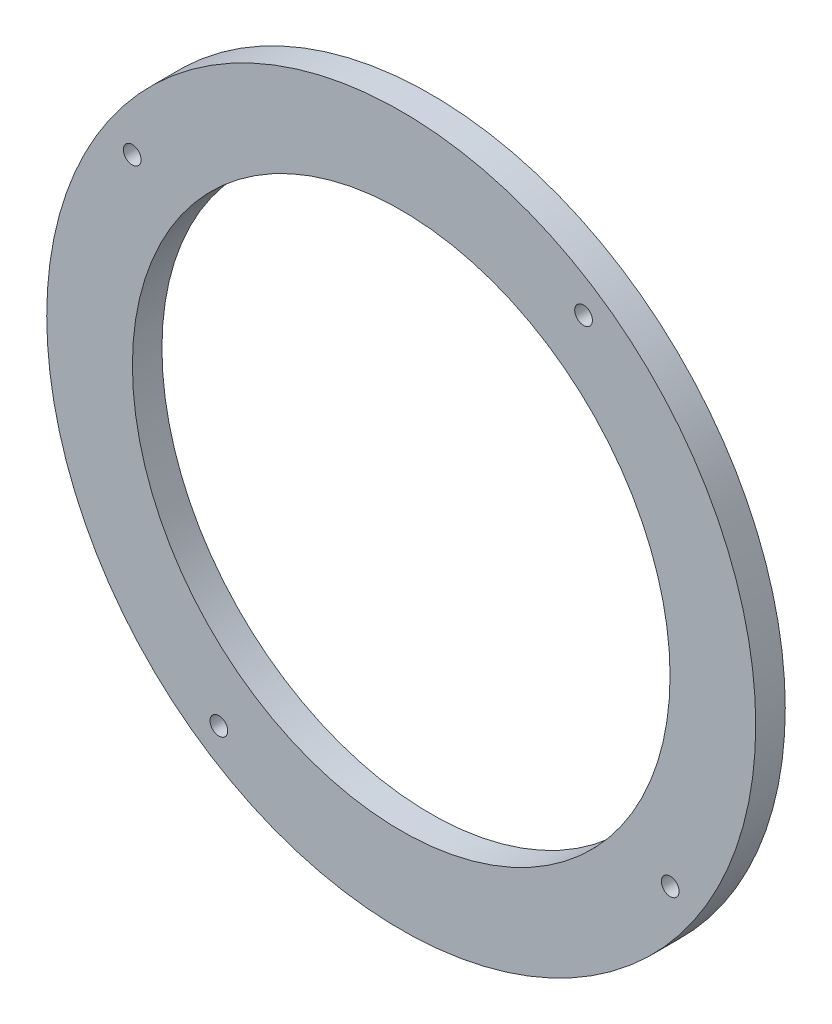
ISO-10303-21;
HEADER;
FILE_DESCRIPTION(('STEP AP214'),'2;1');
FILE_NAME('part.step','',(''),(''),'','','');
FILE_SCHEMA(('AUTOMOTIVE_DESIGN { 1 0 10303 214 1 1 1 1 }'));
ENDSEC;
DATA;
#1=APPLICATION_CONTEXT('core data for automotive mechanical design processes');
#2=APPLICATION_PROTOCOL_DEFINITION('international standard','automotive_design',2000,#1);
#3=PRODUCT_CONTEXT('',#1,'mechanical');
#4=PRODUCT('Part','Part','',(#3));
#5=PRODUCT_RELATED_PRODUCT_CATEGORY('part','',(#4));
#6=PRODUCT_DEFINITION_FORMATION('','',#4);
#7=PRODUCT_DEFINITION_CONTEXT('part definition',#1,'design');
#8=PRODUCT_DEFINITION('design','',#6,#7);
#9=PRODUCT_DEFINITION_SHAPE('','',#8);
#10=(LENGTH_UNIT() NAMED_UNIT(*) SI_UNIT(.MILLI.,.METRE.));
#11=(NAMED_UNIT(*) PLANE_ANGLE_UNIT() SI_UNIT($,.RADIAN.));
#12=(NAMED_UNIT(*) SI_UNIT($,.STERADIAN.) SOLID_ANGLE_UNIT());
#13=UNCERTAINTY_MEASURE_WITH_UNIT(LENGTH_MEASURE(1.E-05),#10,'distance_accuracy_value','');
#14=(GEOMETRIC_REPRESENTATION_CONTEXT(3) GLOBAL_UNCERTAINTY_ASSIGNED_CONTEXT((#13)) GLOBAL_UNIT_ASSIGNED_CONTEXT((#10,
#11,#12)) REPRESENTATION_CONTEXT('',''));
#15=CARTESIAN_POINT('',(0.,0.,0.));
#16=DIRECTION('',(0.,0.,1.));
#17=DIRECTION('',(1.,0.,0.));
#18=AXIS2_PLACEMENT_3D('',#15,#16,#17);
#19=CARTESIAN_POINT('',(0.,0.,5.));
#20=DIRECTION('',(0.,0.,1.));
#21=DIRECTION('',(1.,0.,0.));
#22=AXIS2_PLACEMENT_3D('',#19,#20,#21);
#23=PLANE('',#22);
#24=CARTESIAN_POINT('',(-30.8599079291922,-45.5265426163878,5.));
#25=DIRECTION('',(0.,0.,1.));
#26=DIRECTION('',(1.,0.,0.));
#27=AXIS2_PLACEMENT_3D('',#24,#25,#26);
#28=CIRCLE('',#27,1.5);
#29=CARTESIAN_POINT('',(-29.3599079291922,-45.5265426163878,5.));
#30=VERTEX_POINT('',#29);
#31=EDGE_CURVE('E68',#30,#30,#28,.T.);
#32=ORIENTED_EDGE('',*,*,#31,.F.);
#33=EDGE_LOOP('',(#32));
#34=FACE_BOUND('',#33,.T.);
#35=CARTESIAN_POINT('',(-45.5265426163877,30.8599079291924,5.));
#36=DIRECTION('',(0.,0.,1.));
#37=DIRECTION('',(1.,0.,0.));
#38=AXIS2_PLACEMENT_3D('',#35,#36,#37);
#39=CIRCLE('',#38,1.5);
#40=CARTESIAN_POINT('',(-44.0265426163877,30.8599079291924,5.));
#41=VERTEX_POINT('',#40);
#42=EDGE_CURVE('E62',#41,#41,#39,.T.);
#43=ORIENTED_EDGE('',*,*,#42,.F.);
#44=EDGE_LOOP('',(#43));
#45=FACE_BOUND('',#44,.T.);
#46=CARTESIAN_POINT('',(30.8599079291926,45.5265426163876,5.));
#47=DIRECTION('',(0.,0.,1.));
#48=DIRECTION('',(1.,0.,0.));
#49=AXIS2_PLACEMENT_3D('',#46,#47,#48);
#50=CIRCLE('',#49,1.5);
#51=CARTESIAN_POINT('',(32.3599079291926,45.5265426163876,5.));
#52=VERTEX_POINT('',#51);
#53=EDGE_CURVE('E56',#52,#52,#50,.T.);
#54=ORIENTED_EDGE('',*,*,#53,.F.);
#55=EDGE_LOOP('',(#54));
#56=FACE_BOUND('',#55,.T.);
#57=CARTESIAN_POINT('',(45.5265426163875,-30.8599079291927,5.));
#58=DIRECTION('',(0.,0.,1.));
#59=DIRECTION('',(1.,0.,0.));
#60=AXIS2_PLACEMENT_3D('',#57,#58,#59);
#61=CIRCLE('',#60,1.5);
#62=CARTESIAN_POINT('',(47.0265426163875,-30.8599079291927,5.));
#63=VERTEX_POINT('',#62);
#64=EDGE_CURVE('E50',#63,#63,#61,.T.);
#65=ORIENTED_EDGE('',*,*,#64,.F.);
#66=EDGE_LOOP('',(#65));
#67=FACE_BOUND('',#66,.T.);
#68=CARTESIAN_POINT('',(0.,0.,5.));
#69=DIRECTION('',(0.,0.,1.));
#70=DIRECTION('',(1.,0.,0.));
#71=AXIS2_PLACEMENT_3D('',#68,#69,#70);
#72=CIRCLE('',#71,60.);
#73=CARTESIAN_POINT('',(60.,0.,5.));
#74=VERTEX_POINT('',#73);
#75=EDGE_CURVE('E10',#74,#74,#72,.T.);
#76=ORIENTED_EDGE('',*,*,#75,.T.);
#77=EDGE_LOOP('',(#76));
#78=FACE_BOUND('',#77,.T.);
#79=CARTESIAN_POINT('',(0.,0.,5.));
#80=DIRECTION('',(0.,0.,1.));
#81=DIRECTION('',(1.,0.,0.));
#82=AXIS2_PLACEMENT_3D('',#79,#80,#81);
#83=CIRCLE('',#82,45.5);
#84=CARTESIAN_POINT('',(45.5,0.,5.));
#85=VERTEX_POINT('',#84);
#86=EDGE_CURVE('E42',#85,#85,#83,.T.);
#87=ORIENTED_EDGE('',*,*,#86,.F.);
#88=EDGE_LOOP('',(#87));
#89=FACE_BOUND('',#88,.T.);
#90=ADVANCED_FACE('F31',(#34,#45,#56,#67,#78,#89),#23,.T.);
#91=CARTESIAN_POINT('',(0.,0.,0.));
#92=DIRECTION('',(0.,0.,1.));
#93=DIRECTION('',(1.,0.,0.));
#94=AXIS2_PLACEMENT_3D('',#91,#92,#93);
#95=PLANE('',#94);
#96=CARTESIAN_POINT('',(-30.8599079291922,-45.5265426163878,0.));
#97=DIRECTION('',(0.,0.,1.));
#98=DIRECTION('',(1.,0.,0.));
#99=AXIS2_PLACEMENT_3D('',#96,#97,#98);
#100=CIRCLE('',#99,1.5);
#101=CARTESIAN_POINT('',(-29.3599079291922,-45.5265426163878,0.));
#102=VERTEX_POINT('',#101);
#103=EDGE_CURVE('E47',#102,#102,#100,.T.);
#104=ORIENTED_EDGE('',*,*,#103,.T.);
#105=EDGE_LOOP('',(#104));
#106=FACE_BOUND('',#105,.T.);
#107=CARTESIAN_POINT('',(-45.5265426163877,30.8599079291924,0.));
#108=DIRECTION('',(0.,0.,1.));
#109=DIRECTION('',(1.,0.,0.));
#110=AXIS2_PLACEMENT_3D('',#107,#108,#109);
#111=CIRCLE('',#110,1.5);
#112=CARTESIAN_POINT('',(-44.0265426163877,30.8599079291924,0.));
#113=VERTEX_POINT('',#112);
#114=EDGE_CURVE('E65',#113,#113,#111,.T.);
#115=ORIENTED_EDGE('',*,*,#114,.T.);
#116=EDGE_LOOP('',(#115));
#117=FACE_BOUND('',#116,.T.);
#118=CARTESIAN_POINT('',(30.8599079291926,45.5265426163876,0.));
#119=DIRECTION('',(0.,0.,1.));
#120=DIRECTION('',(1.,0.,0.));
#121=AXIS2_PLACEMENT_3D('',#118,#119,#120);
#122=CIRCLE('',#121,1.5);
#123=CARTESIAN_POINT('',(32.3599079291926,45.5265426163876,0.));
#124=VERTEX_POINT('',#123);
#125=EDGE_CURVE('E59',#124,#124,#122,.T.);
#126=ORIENTED_EDGE('',*,*,#125,.T.);
#127=EDGE_LOOP('',(#126));
#128=FACE_BOUND('',#127,.T.);
#129=CARTESIAN_POINT('',(45.5265426163875,-30.8599079291927,0.));
#130=DIRECTION('',(0.,0.,1.));
#131=DIRECTION('',(1.,0.,0.));
#132=AXIS2_PLACEMENT_3D('',#129,#130,#131);
#133=CIRCLE('',#132,1.5);
#134=CARTESIAN_POINT('',(47.0265426163875,-30.8599079291927,0.));
#135=VERTEX_POINT('',#134);
#136=EDGE_CURVE('E53',#135,#135,#133,.T.);
#137=ORIENTED_EDGE('',*,*,#136,.T.);
#138=EDGE_LOOP('',(#137));
#139=FACE_BOUND('',#138,.T.);
#140=CARTESIAN_POINT('',(0.,0.,0.));
#141=DIRECTION('',(0.,0.,1.));
#142=DIRECTION('',(1.,0.,0.));
#143=AXIS2_PLACEMENT_3D('',#140,#141,#142);
#144=CIRCLE('',#143,60.);
#145=CARTESIAN_POINT('',(60.,0.,0.));
#146=VERTEX_POINT('',#145);
#147=EDGE_CURVE('E35',#146,#146,#144,.T.);
#148=ORIENTED_EDGE('',*,*,#147,.F.);
#149=EDGE_LOOP('',(#148));
#150=FACE_BOUND('',#149,.T.);
#151=CARTESIAN_POINT('',(0.,0.,0.));
#152=DIRECTION('',(0.,0.,1.));
#153=DIRECTION('',(1.,0.,0.));
#154=AXIS2_PLACEMENT_3D('',#151,#152,#153);
#155=CIRCLE('',#154,45.5);
#156=CARTESIAN_POINT('',(45.5,0.,0.));
#157=VERTEX_POINT('',#156);
#158=EDGE_CURVE('E44',#157,#157,#155,.T.);
#159=ORIENTED_EDGE('',*,*,#158,.T.);
#160=EDGE_LOOP('',(#159));
#161=FACE_BOUND('',#160,.T.);
#162=ADVANCED_FACE('F74',(#106,#117,#128,#139,#150,#161),#95,.F.);
#163=CARTESIAN_POINT('',(0.,0.,5.));
#164=DIRECTION('',(0.,0.,-1.));
#165=DIRECTION('',(-1.,0.,0.));
#166=AXIS2_PLACEMENT_3D('',#163,#164,#165);
#167=CYLINDRICAL_SURFACE('',#166,60.);
#168=ORIENTED_EDGE('',*,*,#75,.F.);
#169=EDGE_LOOP('',(#168));
#170=FACE_BOUND('',#169,.T.);
#171=ORIENTED_EDGE('',*,*,#147,.T.);
#172=EDGE_LOOP('',(#171));
#173=FACE_BOUND('',#172,.T.);
#174=ADVANCED_FACE('F33',(#170,#173),#167,.T.);
#175=CARTESIAN_POINT('',(0.,0.,5.));
#176=DIRECTION('',(0.,0.,-1.));
#177=DIRECTION('',(-1.,0.,0.));
#178=AXIS2_PLACEMENT_3D('',#175,#176,#177);
#179=CYLINDRICAL_SURFACE('',#178,45.5);
#180=ORIENTED_EDGE('',*,*,#86,.T.);
#181=EDGE_LOOP('',(#180));
#182=FACE_BOUND('',#181,.T.);
#183=ORIENTED_EDGE('',*,*,#158,.F.);
#184=EDGE_LOOP('',(#183));
#185=FACE_BOUND('',#184,.T.);
#186=ADVANCED_FACE('F95',(#182,#185),#179,.F.);
#187=CARTESIAN_POINT('',(45.5265426163875,-30.8599079291927,0.));
#188=DIRECTION('',(0.,0.,1.));
#189=DIRECTION('',(1.,0.,0.));
#190=AXIS2_PLACEMENT_3D('',#187,#188,#189);
#191=CYLINDRICAL_SURFACE('',#190,1.5);
#192=ORIENTED_EDGE('',*,*,#136,.F.);
#193=EDGE_LOOP('',(#192));
#194=FACE_BOUND('',#193,.T.);
#195=ORIENTED_EDGE('',*,*,#64,.T.);
#196=EDGE_LOOP('',(#195));
#197=FACE_BOUND('',#196,.T.);
#198=ADVANCED_FACE('F98',(#194,#197),#191,.F.);
#199=CARTESIAN_POINT('',(30.8599079291926,45.5265426163876,0.));
#200=DIRECTION('',(0.,0.,1.));
#201=DIRECTION('',(1.,0.,0.));
#202=AXIS2_PLACEMENT_3D('',#199,#200,#201);
#203=CYLINDRICAL_SURFACE('',#202,1.5);
#204=ORIENTED_EDGE('',*,*,#125,.F.);
#205=EDGE_LOOP('',(#204));
#206=FACE_BOUND('',#205,.T.);
#207=ORIENTED_EDGE('',*,*,#53,.T.);
#208=EDGE_LOOP('',(#207));
#209=FACE_BOUND('',#208,.T.);
#210=ADVANCED_FACE('F110',(#206,#209),#203,.F.);
#211=CARTESIAN_POINT('',(-45.5265426163877,30.8599079291924,0.));
#212=DIRECTION('',(0.,0.,1.));
#213=DIRECTION('',(1.,0.,0.));
#214=AXIS2_PLACEMENT_3D('',#211,#212,#213);
#215=CYLINDRICAL_SURFACE('',#214,1.5);
#216=ORIENTED_EDGE('',*,*,#114,.F.);
#217=EDGE_LOOP('',(#216));
#218=FACE_BOUND('',#217,.T.);
#219=ORIENTED_EDGE('',*,*,#42,.T.);
#220=EDGE_LOOP('',(#219));
#221=FACE_BOUND('',#220,.T.);
#222=ADVANCED_FACE('F80',(#218,#221),#215,.F.);
#223=CARTESIAN_POINT('',(-30.8599079291922,-45.5265426163878,0.));
#224=DIRECTION('',(0.,0.,1.));
#225=DIRECTION('',(1.,0.,0.));
#226=AXIS2_PLACEMENT_3D('',#223,#224,#225);
#227=CYLINDRICAL_SURFACE('',#226,1.5);
#228=ORIENTED_EDGE('',*,*,#103,.F.);
#229=EDGE_LOOP('',(#228));
#230=FACE_BOUND('',#229,.T.);
#231=ORIENTED_EDGE('',*,*,#31,.T.);
#232=EDGE_LOOP('',(#231));
#233=FACE_BOUND('',#232,.T.);
#234=ADVANCED_FACE('F77',(#230,#233),#227,.F.);
#235=CLOSED_SHELL('',(#90,#162,#174,#186,#198,#210,#222,#234));
#236=MANIFOLD_SOLID_BREP('B2',#235);
#237=ADVANCED_BREP_SHAPE_REPRESENTATION('',(#18,#236),#14);
#238=SHAPE_DEFINITION_REPRESENTATION(#9,#237);
ENDSEC;
END-ISO-10303-21;
